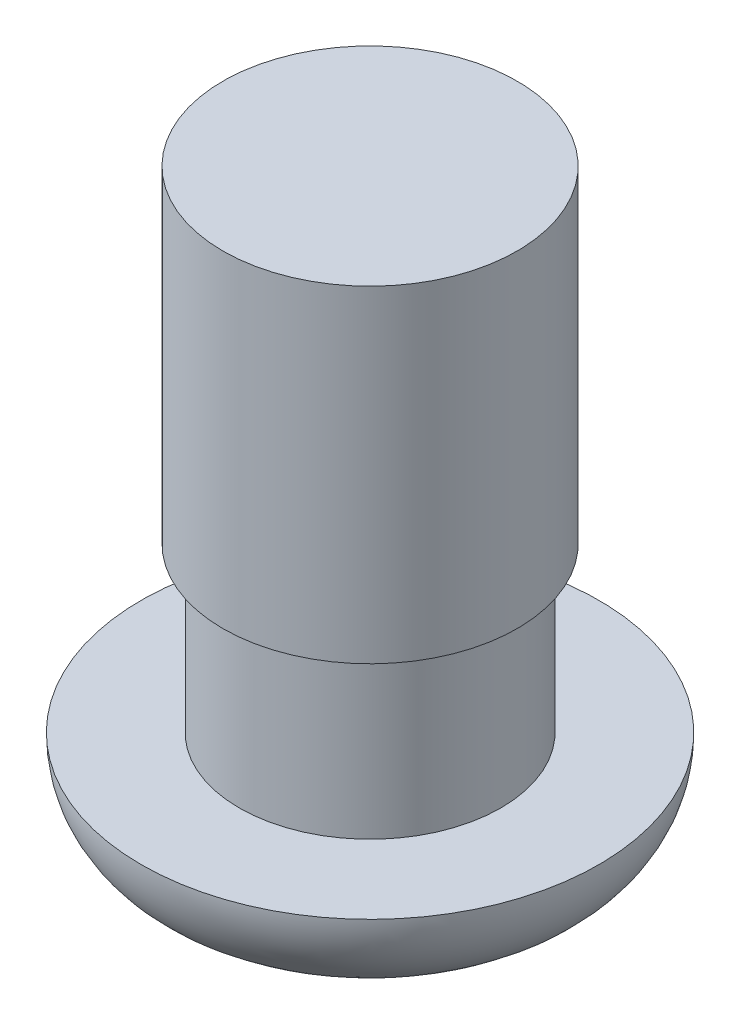
ISO-10303-21;
HEADER;
FILE_DESCRIPTION(('STEP AP214'),'2;1');
FILE_NAME('part.step','',(''),(''),'','','');
FILE_SCHEMA(('AUTOMOTIVE_DESIGN { 1 0 10303 214 1 1 1 1 }'));
ENDSEC;
DATA;
#1=APPLICATION_CONTEXT('core data for automotive mechanical design processes');
#2=APPLICATION_PROTOCOL_DEFINITION('international standard','automotive_design',2000,#1);
#3=PRODUCT_CONTEXT('',#1,'mechanical');
#4=PRODUCT('Part','Part','',(#3));
#5=PRODUCT_RELATED_PRODUCT_CATEGORY('part','',(#4));
#6=PRODUCT_DEFINITION_FORMATION('','',#4);
#7=PRODUCT_DEFINITION_CONTEXT('part definition',#1,'design');
#8=PRODUCT_DEFINITION('design','',#6,#7);
#9=PRODUCT_DEFINITION_SHAPE('','',#8);
#10=(LENGTH_UNIT() NAMED_UNIT(*) SI_UNIT(.MILLI.,.METRE.));
#11=(NAMED_UNIT(*) PLANE_ANGLE_UNIT() SI_UNIT($,.RADIAN.));
#12=(NAMED_UNIT(*) SI_UNIT($,.STERADIAN.) SOLID_ANGLE_UNIT());
#13=UNCERTAINTY_MEASURE_WITH_UNIT(LENGTH_MEASURE(1.E-05),#10,'distance_accuracy_value','');
#14=(GEOMETRIC_REPRESENTATION_CONTEXT(3) GLOBAL_UNCERTAINTY_ASSIGNED_CONTEXT((#13)) GLOBAL_UNIT_ASSIGNED_CONTEXT((#10,
#11,#12)) REPRESENTATION_CONTEXT('',''));
#15=CARTESIAN_POINT('',(0.,0.,0.));
#16=DIRECTION('',(0.,0.,1.));
#17=DIRECTION('',(1.,0.,0.));
#18=AXIS2_PLACEMENT_3D('',#15,#16,#17);
#19=CARTESIAN_POINT('',(0.,0.,0.));
#20=DIRECTION('',(0.,-1.,0.));
#21=DIRECTION('',(0.,0.,-1.));
#22=AXIS2_PLACEMENT_3D('',#19,#20,#21);
#23=PLANE('',#22);
#24=CARTESIAN_POINT('',(0.,0.,0.));
#25=DIRECTION('',(0.,1.,0.));
#26=DIRECTION('',(0.,0.,1.));
#27=AXIS2_PLACEMENT_3D('',#24,#25,#26);
#28=CIRCLE('',#27,2.);
#29=CARTESIAN_POINT('',(0.,0.,2.));
#30=VERTEX_POINT('',#29);
#31=EDGE_CURVE('E10',#30,#30,#28,.T.);
#32=ORIENTED_EDGE('',*,*,#31,.F.);
#33=EDGE_LOOP('',(#32));
#34=FACE_BOUND('',#33,.T.);
#35=ADVANCED_FACE('F37',(#34),#23,.T.);
#36=CARTESIAN_POINT('',(0.,1.5,0.));
#37=DIRECTION('',(0.,1.,0.));
#38=DIRECTION('',(0.,0.,1.));
#39=AXIS2_PLACEMENT_3D('',#36,#37,#38);
#40=TOROIDAL_SURFACE('',#39,2.,1.5);
#41=ORIENTED_EDGE('',*,*,#31,.T.);
#42=EDGE_LOOP('',(#41));
#43=FACE_BOUND('',#42,.T.);
#44=CARTESIAN_POINT('',(0.,1.5,0.));
#45=DIRECTION('',(0.,1.,0.));
#46=DIRECTION('',(0.,0.,1.));
#47=AXIS2_PLACEMENT_3D('',#44,#45,#46);
#48=CIRCLE('',#47,3.5);
#49=CARTESIAN_POINT('',(0.,1.5,3.5));
#50=VERTEX_POINT('',#49);
#51=EDGE_CURVE('E43',#50,#50,#48,.T.);
#52=ORIENTED_EDGE('',*,*,#51,.F.);
#53=EDGE_LOOP('',(#52));
#54=FACE_BOUND('',#53,.T.);
#55=ADVANCED_FACE('F79',(#43,#54),#40,.T.);
#56=CARTESIAN_POINT('',(0.,1.5,3.5));
#57=DIRECTION('',(0.,1.,0.));
#58=DIRECTION('',(0.,0.,1.));
#59=AXIS2_PLACEMENT_3D('',#56,#57,#58);
#60=PLANE('',#59);
#61=ORIENTED_EDGE('',*,*,#51,.T.);
#62=EDGE_LOOP('',(#61));
#63=FACE_BOUND('',#62,.T.);
#64=CARTESIAN_POINT('',(0.,1.5,0.));
#65=DIRECTION('',(0.,1.,0.));
#66=DIRECTION('',(0.,0.,1.));
#67=AXIS2_PLACEMENT_3D('',#64,#65,#66);
#68=CIRCLE('',#67,2.);
#69=CARTESIAN_POINT('',(0.,1.5,2.));
#70=VERTEX_POINT('',#69);
#71=EDGE_CURVE('E47',#70,#70,#68,.T.);
#72=ORIENTED_EDGE('',*,*,#71,.F.);
#73=EDGE_LOOP('',(#72));
#74=FACE_BOUND('',#73,.T.);
#75=ADVANCED_FACE('F84',(#63,#74),#60,.T.);
#76=CARTESIAN_POINT('',(0.,0.,0.));
#77=DIRECTION('',(0.,1.,0.));
#78=DIRECTION('',(0.,0.,1.));
#79=AXIS2_PLACEMENT_3D('',#76,#77,#78);
#80=CYLINDRICAL_SURFACE('',#79,2.);
#81=ORIENTED_EDGE('',*,*,#71,.T.);
#82=EDGE_LOOP('',(#81));
#83=FACE_BOUND('',#82,.T.);
#84=CARTESIAN_POINT('',(0.,4.,0.));
#85=DIRECTION('',(0.,1.,0.));
#86=DIRECTION('',(0.,0.,1.));
#87=AXIS2_PLACEMENT_3D('',#84,#85,#86);
#88=CIRCLE('',#87,2.);
#89=CARTESIAN_POINT('',(0.,4.,2.));
#90=VERTEX_POINT('',#89);
#91=EDGE_CURVE('E51',#90,#90,#88,.T.);
#92=ORIENTED_EDGE('',*,*,#91,.F.);
#93=EDGE_LOOP('',(#92));
#94=FACE_BOUND('',#93,.T.);
#95=ADVANCED_FACE('F75',(#83,#94),#80,.T.);
#96=CARTESIAN_POINT('',(0.,4.,2.));
#97=DIRECTION('',(0.,-1.,0.));
#98=DIRECTION('',(0.,0.,-1.));
#99=AXIS2_PLACEMENT_3D('',#96,#97,#98);
#100=PLANE('',#99);
#101=ORIENTED_EDGE('',*,*,#91,.T.);
#102=EDGE_LOOP('',(#101));
#103=FACE_BOUND('',#102,.T.);
#104=CARTESIAN_POINT('',(0.,4.,0.));
#105=DIRECTION('',(0.,1.,0.));
#106=DIRECTION('',(0.,0.,1.));
#107=AXIS2_PLACEMENT_3D('',#104,#105,#106);
#108=CIRCLE('',#107,2.25);
#109=CARTESIAN_POINT('',(0.,4.,2.25));
#110=VERTEX_POINT('',#109);
#111=EDGE_CURVE('E56',#110,#110,#108,.T.);
#112=ORIENTED_EDGE('',*,*,#111,.F.);
#113=EDGE_LOOP('',(#112));
#114=FACE_BOUND('',#113,.T.);
#115=ADVANCED_FACE('F67',(#103,#114),#100,.T.);
#116=CARTESIAN_POINT('',(0.,0.,0.));
#117=DIRECTION('',(0.,1.,0.));
#118=DIRECTION('',(0.,0.,1.));
#119=AXIS2_PLACEMENT_3D('',#116,#117,#118);
#120=CYLINDRICAL_SURFACE('',#119,2.25);
#121=ORIENTED_EDGE('',*,*,#111,.T.);
#122=EDGE_LOOP('',(#121));
#123=FACE_BOUND('',#122,.T.);
#124=CARTESIAN_POINT('',(0.,9.,0.));
#125=DIRECTION('',(0.,1.,0.));
#126=DIRECTION('',(0.,0.,1.));
#127=AXIS2_PLACEMENT_3D('',#124,#125,#126);
#128=CIRCLE('',#127,2.25);
#129=CARTESIAN_POINT('',(0.,9.,2.25));
#130=VERTEX_POINT('',#129);
#131=EDGE_CURVE('E59',#130,#130,#128,.T.);
#132=ORIENTED_EDGE('',*,*,#131,.F.);
#133=EDGE_LOOP('',(#132));
#134=FACE_BOUND('',#133,.T.);
#135=ADVANCED_FACE('F65',(#123,#134),#120,.T.);
#136=CARTESIAN_POINT('',(0.,9.,2.25));
#137=DIRECTION('',(0.,1.,0.));
#138=DIRECTION('',(0.,0.,1.));
#139=AXIS2_PLACEMENT_3D('',#136,#137,#138);
#140=PLANE('',#139);
#141=ORIENTED_EDGE('',*,*,#131,.T.);
#142=EDGE_LOOP('',(#141));
#143=FACE_BOUND('',#142,.T.);
#144=ADVANCED_FACE('F63',(#143),#140,.T.);
#145=CLOSED_SHELL('',(#35,#55,#75,#95,#115,#135,#144));
#146=MANIFOLD_SOLID_BREP('B2',#145);
#147=ADVANCED_BREP_SHAPE_REPRESENTATION('',(#18,#146),#14);
#148=SHAPE_DEFINITION_REPRESENTATION(#9,#147);
ENDSEC;
END-ISO-10303-21;
